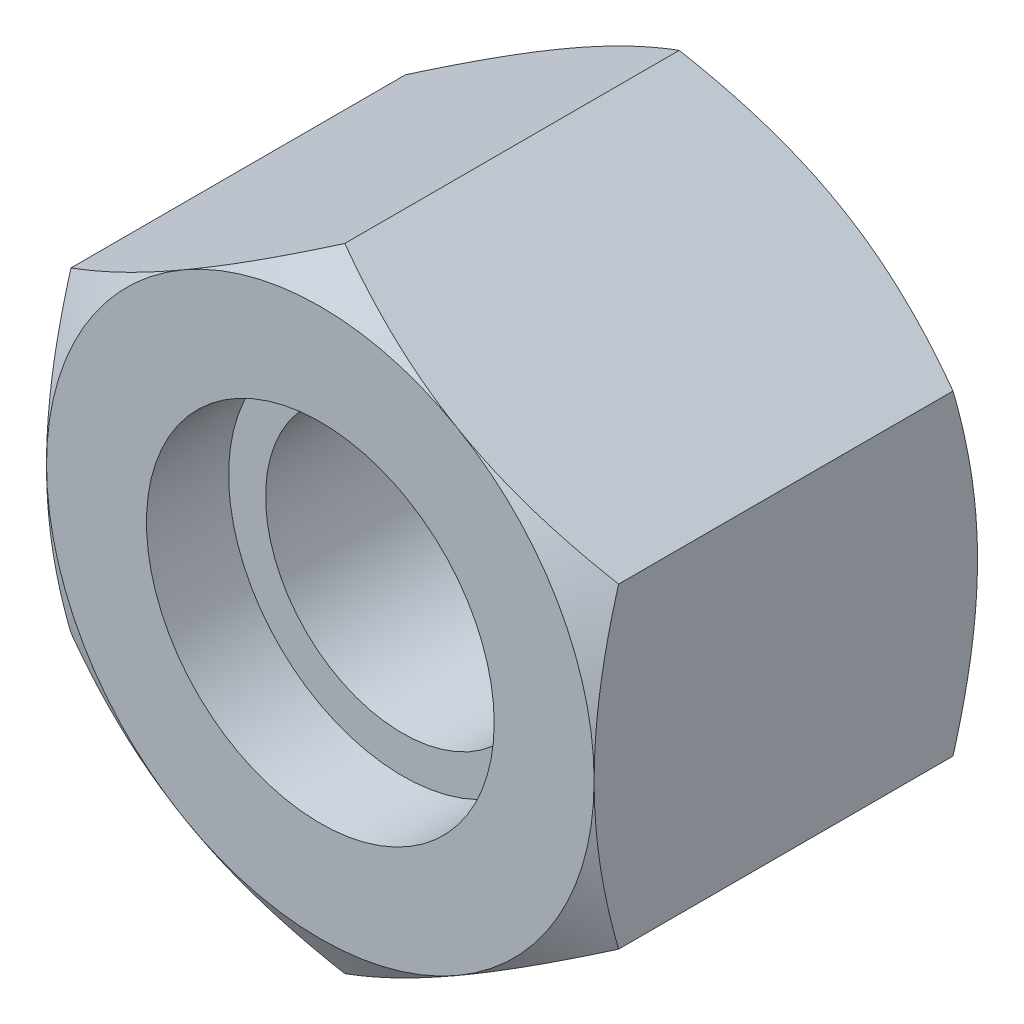
ISO-10303-21;
HEADER;
FILE_DESCRIPTION(('STEP AP214'),'2;1');
FILE_NAME('part.step','',(''),(''),'','','');
FILE_SCHEMA(('AUTOMOTIVE_DESIGN { 1 0 10303 214 1 1 1 1 }'));
ENDSEC;
DATA;
#1=APPLICATION_CONTEXT('core data for automotive mechanical design processes');
#2=APPLICATION_PROTOCOL_DEFINITION('international standard','automotive_design',2000,#1);
#3=PRODUCT_CONTEXT('',#1,'mechanical');
#4=PRODUCT('Part','Part','',(#3));
#5=PRODUCT_RELATED_PRODUCT_CATEGORY('part','',(#4));
#6=PRODUCT_DEFINITION_FORMATION('','',#4);
#7=PRODUCT_DEFINITION_CONTEXT('part definition',#1,'design');
#8=PRODUCT_DEFINITION('design','',#6,#7);
#9=PRODUCT_DEFINITION_SHAPE('','',#8);
#10=(LENGTH_UNIT() NAMED_UNIT(*) SI_UNIT(.MILLI.,.METRE.));
#11=(NAMED_UNIT(*) PLANE_ANGLE_UNIT() SI_UNIT($,.RADIAN.));
#12=(NAMED_UNIT(*) SI_UNIT($,.STERADIAN.) SOLID_ANGLE_UNIT());
#13=UNCERTAINTY_MEASURE_WITH_UNIT(LENGTH_MEASURE(1.E-05),#10,'distance_accuracy_value','');
#14=(GEOMETRIC_REPRESENTATION_CONTEXT(3) GLOBAL_UNCERTAINTY_ASSIGNED_CONTEXT((#13)) GLOBAL_UNIT_ASSIGNED_CONTEXT((#10,
#11,#12)) REPRESENTATION_CONTEXT('',''));
#15=CARTESIAN_POINT('',(0.,0.,0.));
#16=DIRECTION('',(0.,0.,1.));
#17=DIRECTION('',(1.,0.,0.));
#18=AXIS2_PLACEMENT_3D('',#15,#16,#17);
#19=CARTESIAN_POINT('',(0.,0.,7.));
#20=DIRECTION('',(0.,0.,1.));
#21=DIRECTION('',(1.,0.,0.));
#22=AXIS2_PLACEMENT_3D('',#19,#20,#21);
#23=CYLINDRICAL_SURFACE('',#22,2.5);
#24=CARTESIAN_POINT('',(0.,0.,0.));
#25=DIRECTION('',(0.,0.,1.));
#26=DIRECTION('',(1.,0.,0.));
#27=AXIS2_PLACEMENT_3D('',#24,#25,#26);
#28=CIRCLE('',#27,2.5);
#29=CARTESIAN_POINT('',(2.5,0.,0.));
#30=VERTEX_POINT('',#29);
#31=EDGE_CURVE('E231',#30,#30,#28,.T.);
#32=ORIENTED_EDGE('',*,*,#31,.F.);
#33=EDGE_LOOP('',(#32));
#34=FACE_BOUND('',#33,.T.);
#35=CARTESIAN_POINT('',(0.,0.,5.5));
#36=DIRECTION('',(0.,0.,1.));
#37=DIRECTION('',(1.,0.,0.));
#38=AXIS2_PLACEMENT_3D('',#35,#36,#37);
#39=CIRCLE('',#38,2.5);
#40=CARTESIAN_POINT('',(2.5,0.,5.5));
#41=VERTEX_POINT('',#40);
#42=EDGE_CURVE('E37',#41,#41,#39,.F.);
#43=ORIENTED_EDGE('',*,*,#42,.F.);
#44=EDGE_LOOP('',(#43));
#45=FACE_BOUND('',#44,.T.);
#46=ADVANCED_FACE('F32',(#34,#45),#23,.F.);
#47=CARTESIAN_POINT('',(5.,2.88675134594813,7.));
#48=DIRECTION('',(-0.5,-0.866025403784439,0.));
#49=DIRECTION('',(0.866025403784439,-0.5,0.));
#50=AXIS2_PLACEMENT_3D('',#47,#48,#49);
#51=PLANE('',#50);
#52=DIRECTION('',(0.,0.,-1.));
#53=VECTOR('',#52,1.);
#54=CARTESIAN_POINT('',(5.,2.88675134594813,7.));
#55=LINE('',#54,#53);
#56=CARTESIAN_POINT('',(5.,2.88675134594813,6.5534180126148));
#57=VERTEX_POINT('',#56);
#58=CARTESIAN_POINT('',(5.,2.88675134594813,0.446581987385197));
#59=VERTEX_POINT('',#58);
#60=EDGE_CURVE('E148',#57,#59,#55,.T.);
#61=ORIENTED_EDGE('',*,*,#60,.T.);
#62=CARTESIAN_POINT('',(5.0002,2.88663587589429,0.446648656051824));
#63=CARTESIAN_POINT('',(4.78046540547481,3.01349970319368,0.373386567637631));
#64=CARTESIAN_POINT('',(4.55885141554042,3.14144859993849,0.306751321918089));
#65=CARTESIAN_POINT('',(4.11178600454649,3.39956193532121,0.190438991010809));
#66=CARTESIAN_POINT('',(3.88632664040923,3.52973095989718,0.140803049915787));
#67=CARTESIAN_POINT('',(3.43816769477649,3.78847564779797,0.0635510254186972));
#68=CARTESIAN_POINT('',(3.21553790689581,3.91701101576052,0.0354203782834892));
#69=CARTESIAN_POINT('',(2.88081009815336,4.11026620624322,0.0101949219536843));
#70=CARTESIAN_POINT('',(2.76915780319494,4.17472868879311,0.00461345976948369));
#71=CARTESIAN_POINT('',(2.5457500293262,4.30371322717528,-0.000797783248529976));
#72=CARTESIAN_POINT('',(2.43399455370969,4.36823528110589,-0.000627741741796593));
#73=CARTESIAN_POINT('',(2.12781576914936,4.54500768479194,0.00775363179203671));
#74=CARTESIAN_POINT('',(1.93349391403279,4.65719946015292,0.0218297718972513));
#75=CARTESIAN_POINT('',(1.54613989800229,4.88083840557981,0.06646525710943));
#76=CARTESIAN_POINT('',(1.35310909862843,4.9922847895602,0.0970398601475072));
#77=CARTESIAN_POINT('',(0.964974657525146,5.21637431361295,0.173468493621162));
#78=CARTESIAN_POINT('',(0.769920001358264,5.32898917185759,0.219646378878678));
#79=CARTESIAN_POINT('',(0.382719654641231,5.55253939626498,0.324451794491931));
#80=CARTESIAN_POINT('',(0.190569004591912,5.66347762579592,0.383054703437371));
#81=CARTESIAN_POINT('',(-0.000200000000001403,5.77361816195009,0.446648656051825));
#82=B_SPLINE_CURVE_WITH_KNOTS('',3,(#62,#63,#64,#65,#66,#67,#68,#69,#70,#71,#72,#73,#74,#75,#76,
#77,#78,#79,#80,#81),.UNSPECIFIED.,.F.,.F.,(4,2,2,2,2,2,2,2,2,4),(0.,0.792555841363088,
1.58701660053333,2.3618153748728,2.74884076077325,3.13585419177295,3.80962362599679,
4.48401723901189,5.17336882348928,5.86136694793725),.UNSPECIFIED.);
#83=CARTESIAN_POINT('',(2.5,4.33012701892219,0.));
#84=VERTEX_POINT('',#83);
#85=EDGE_CURVE('E55',#59,#84,#82,.T.);
#86=ORIENTED_EDGE('',*,*,#85,.T.);
#87=CARTESIAN_POINT('',(0.,5.77350269189626,0.446581987385198));
#88=VERTEX_POINT('',#87);
#89=EDGE_CURVE('E123',#84,#88,#82,.T.);
#90=ORIENTED_EDGE('',*,*,#89,.T.);
#91=DIRECTION('',(0.,0.,-1.));
#92=VECTOR('',#91,1.);
#93=CARTESIAN_POINT('',(0.,5.77350269189626,7.));
#94=LINE('',#93,#92);
#95=CARTESIAN_POINT('',(0.,5.77350269189626,6.5534180126148));
#96=VERTEX_POINT('',#95);
#97=EDGE_CURVE('E243',#96,#88,#94,.T.);
#98=ORIENTED_EDGE('',*,*,#97,.F.);
#99=CARTESIAN_POINT('',(-0.000200000000001735,5.77361816195009,6.55335134394817));
#100=CARTESIAN_POINT('',(0.219534594525183,5.6467543346507,6.62661343236237));
#101=CARTESIAN_POINT('',(0.441148584459579,5.5188054379059,6.69324867808191));
#102=CARTESIAN_POINT('',(0.888213995453512,5.26069210252318,6.80956100898919));
#103=CARTESIAN_POINT('',(1.11367335959077,5.13052307794721,6.85919695008421));
#104=CARTESIAN_POINT('',(1.56183230522351,4.87177839004641,6.9364489745813));
#105=CARTESIAN_POINT('',(1.78446209310419,4.74324302208387,6.96457962171651));
#106=CARTESIAN_POINT('',(2.11918990184664,4.54998783160116,6.98980507804632));
#107=CARTESIAN_POINT('',(2.23084219680506,4.48552534905128,6.99538654023052));
#108=CARTESIAN_POINT('',(2.45424997067379,4.35654081066911,7.00079778324853));
#109=CARTESIAN_POINT('',(2.56600544629031,4.2920187567385,7.0006277417418));
#110=CARTESIAN_POINT('',(2.87218423085064,4.11524635305244,6.99224636820796));
#111=CARTESIAN_POINT('',(3.06650608596721,4.00305457769146,6.97817022810275));
#112=CARTESIAN_POINT('',(3.4538601019977,3.77941563226457,6.93353474289057));
#113=CARTESIAN_POINT('',(3.64689090137157,3.66796924828419,6.90296013985249));
#114=CARTESIAN_POINT('',(4.03502534247485,3.44387972423144,6.82653150637884));
#115=CARTESIAN_POINT('',(4.23007999864173,3.3312648659868,6.78035362112132));
#116=CARTESIAN_POINT('',(4.61728034535877,3.1077146415794,6.67554820550807));
#117=CARTESIAN_POINT('',(4.80943099540808,2.99677641204847,6.61694529656263));
#118=CARTESIAN_POINT('',(5.0002,2.88663587589429,6.55335134394817));
#119=B_SPLINE_CURVE_WITH_KNOTS('',3,(#99,#100,#101,#102,#103,#104,#105,#106,#107,#108,#109,#110,
#111,#112,#113,#114,#115,#116,#117,#118),.UNSPECIFIED.,.F.,.F.,(4,2,2,2,2,2,2,2,2,4),(0.,
0.79255584136309,1.58701660053333,2.3618153748728,2.74884076077325,3.13585419177295,
3.80962362599679,4.48401723901189,5.17336882348928,5.86136694793725),.UNSPECIFIED.);
#120=CARTESIAN_POINT('',(2.5,4.33012701892219,7.));
#121=VERTEX_POINT('',#120);
#122=EDGE_CURVE('E288',#96,#121,#119,.T.);
#123=ORIENTED_EDGE('',*,*,#122,.T.);
#124=EDGE_CURVE('E294',#121,#57,#119,.T.);
#125=ORIENTED_EDGE('',*,*,#124,.T.);
#126=EDGE_LOOP('',(#61,#86,#90,#98,#123,#125));
#127=FACE_BOUND('',#126,.T.);
#128=ADVANCED_FACE('F34',(#127),#51,.F.);
#129=CARTESIAN_POINT('',(0.,5.77350269189626,7.));
#130=DIRECTION('',(0.5,-0.866025403784439,0.));
#131=DIRECTION('',(0.866025403784439,0.5,0.));
#132=AXIS2_PLACEMENT_3D('',#129,#130,#131);
#133=PLANE('',#132);
#134=ORIENTED_EDGE('',*,*,#97,.T.);
#135=CARTESIAN_POINT('',(0.000199999999998311,5.7736181619501,0.446648656051825));
#136=CARTESIAN_POINT('',(-0.219534594525186,5.64675433465071,0.373386567637632));
#137=CARTESIAN_POINT('',(-0.441148584459582,5.5188054379059,0.30675132191809));
#138=CARTESIAN_POINT('',(-0.888213995453514,5.26069210252318,0.19043899101081));
#139=CARTESIAN_POINT('',(-1.11367335959077,5.13052307794721,0.140803049915788));
#140=CARTESIAN_POINT('',(-1.56183230522351,4.87177839004641,0.0635510254186978));
#141=CARTESIAN_POINT('',(-1.78446209310419,4.74324302208387,0.0354203782834896));
#142=CARTESIAN_POINT('',(-2.11918990184664,4.54998783160116,0.010194921953685));
#143=CARTESIAN_POINT('',(-2.23084219680506,4.48552534905128,0.00461345976948456));
#144=CARTESIAN_POINT('',(-2.4542499706738,4.35654081066911,-0.00079778324852902));
#145=CARTESIAN_POINT('',(-2.56600544629031,4.2920187567385,-0.000627741741795739));
#146=CARTESIAN_POINT('',(-2.87218423085064,4.11524635305244,0.00775363179203752));
#147=CARTESIAN_POINT('',(-3.06650608596721,4.00305457769146,0.0218297718972523));
#148=CARTESIAN_POINT('',(-3.4538601019977,3.77941563226458,0.0664652571094308));
#149=CARTESIAN_POINT('',(-3.64689090137157,3.66796924828419,0.0970398601475075));
#150=CARTESIAN_POINT('',(-4.03502534247485,3.44387972423144,0.173468493621162));
#151=CARTESIAN_POINT('',(-4.23007999864173,3.3312648659868,0.219646378878678));
#152=CARTESIAN_POINT('',(-4.61728034535877,3.10771464157941,0.324451794491931));
#153=CARTESIAN_POINT('',(-4.80943099540808,2.99677641204847,0.383054703437371));
#154=CARTESIAN_POINT('',(-5.0002,2.88663587589429,0.446648656051824));
#155=B_SPLINE_CURVE_WITH_KNOTS('',3,(#135,#136,#137,#138,#139,#140,#141,#142,#143,#144,#145,
#146,#147,#148,#149,#150,#151,#152,#153,#154),.UNSPECIFIED.,.F.,.F.,(4,2,2,2,2,2,2,2,2,4),(0.,
0.792555841363089,1.58701660053333,2.3618153748728,2.74884076077325,3.13585419177295,
3.80962362599679,4.48401723901189,5.17336882348928,5.86136694793724),.UNSPECIFIED.);
#156=CARTESIAN_POINT('',(-2.5,4.33012701892219,0.));
#157=VERTEX_POINT('',#156);
#158=EDGE_CURVE('E128',#88,#157,#155,.T.);
#159=ORIENTED_EDGE('',*,*,#158,.T.);
#160=CARTESIAN_POINT('',(-5.,2.88675134594813,0.446581987385198));
#161=VERTEX_POINT('',#160);
#162=EDGE_CURVE('E158',#157,#161,#155,.T.);
#163=ORIENTED_EDGE('',*,*,#162,.T.);
#164=DIRECTION('',(0.,0.,-1.));
#165=VECTOR('',#164,1.);
#166=CARTESIAN_POINT('',(-5.,2.88675134594813,7.));
#167=LINE('',#166,#165);
#168=CARTESIAN_POINT('',(-5.,2.88675134594813,6.5534180126148));
#169=VERTEX_POINT('',#168);
#170=EDGE_CURVE('E240',#169,#161,#167,.T.);
#171=ORIENTED_EDGE('',*,*,#170,.F.);
#172=CARTESIAN_POINT('',(-5.0002,2.88663587589429,6.55335134394817));
#173=CARTESIAN_POINT('',(-4.78046540547481,3.01349970319368,6.62661343236237));
#174=CARTESIAN_POINT('',(-4.55885141554042,3.14144859993849,6.69324867808191));
#175=CARTESIAN_POINT('',(-4.11178600454648,3.39956193532121,6.80956100898919));
#176=CARTESIAN_POINT('',(-3.88632664040922,3.52973095989718,6.85919695008421));
#177=CARTESIAN_POINT('',(-3.43816769477649,3.78847564779798,6.9364489745813));
#178=CARTESIAN_POINT('',(-3.21553790689581,3.91701101576052,6.96457962171651));
#179=CARTESIAN_POINT('',(-2.88081009815336,4.11026620624322,6.98980507804631));
#180=CARTESIAN_POINT('',(-2.76915780319494,4.17472868879311,6.99538654023052));
#181=CARTESIAN_POINT('',(-2.5457500293262,4.30371322717528,7.00079778324853));
#182=CARTESIAN_POINT('',(-2.43399455370969,4.36823528110589,7.0006277417418));
#183=CARTESIAN_POINT('',(-2.12781576914936,4.54500768479194,6.99224636820796));
#184=CARTESIAN_POINT('',(-1.93349391403279,4.65719946015293,6.97817022810275));
#185=CARTESIAN_POINT('',(-1.54613989800229,4.88083840557981,6.93353474289057));
#186=CARTESIAN_POINT('',(-1.35310909862843,4.9922847895602,6.90296013985249));
#187=CARTESIAN_POINT('',(-0.964974657525146,5.21637431361295,6.82653150637884));
#188=CARTESIAN_POINT('',(-0.769920001358265,5.32898917185759,6.78035362112132));
#189=CARTESIAN_POINT('',(-0.382719654641233,5.55253939626498,6.67554820550807));
#190=CARTESIAN_POINT('',(-0.190569004591915,5.66347762579592,6.61694529656263));
#191=CARTESIAN_POINT('',(0.000199999999998361,5.7736181619501,6.55335134394817));
#192=B_SPLINE_CURVE_WITH_KNOTS('',3,(#172,#173,#174,#175,#176,#177,#178,#179,#180,#181,#182,
#183,#184,#185,#186,#187,#188,#189,#190,#191),.UNSPECIFIED.,.F.,.F.,(4,2,2,2,2,2,2,2,2,4),(0.,
0.792555841363089,1.58701660053333,2.3618153748728,2.74884076077325,3.13585419177295,
3.80962362599679,4.48401723901189,5.17336882348928,5.86136694793725),.UNSPECIFIED.);
#193=CARTESIAN_POINT('',(-2.5,4.33012701892219,7.));
#194=VERTEX_POINT('',#193);
#195=EDGE_CURVE('E280',#169,#194,#192,.T.);
#196=ORIENTED_EDGE('',*,*,#195,.T.);
#197=EDGE_CURVE('E224',#194,#96,#192,.T.);
#198=ORIENTED_EDGE('',*,*,#197,.T.);
#199=EDGE_LOOP('',(#134,#159,#163,#171,#196,#198));
#200=FACE_BOUND('',#199,.T.);
#201=ADVANCED_FACE('F209',(#200),#133,.F.);
#202=CARTESIAN_POINT('',(-5.,2.88675134594813,7.));
#203=DIRECTION('',(1.,0.,0.));
#204=DIRECTION('',(0.,0.,-1.));
#205=AXIS2_PLACEMENT_3D('',#202,#203,#204);
#206=PLANE('',#205);
#207=ORIENTED_EDGE('',*,*,#170,.T.);
#208=CARTESIAN_POINT('',(-5.,-7.65608998744864,2.39263352655076));
#209=CARTESIAN_POINT('',(-5.,-7.43656171400165,2.28654533817203));
#210=CARTESIAN_POINT('',(-5.,-7.21651440170021,2.18151175461592));
#211=CARTESIAN_POINT('',(-5.,-6.77510105921518,1.97415643363973));
#212=CARTESIAN_POINT('',(-5.,-6.55373480873052,1.87183516574565));
#213=CARTESIAN_POINT('',(-5.,-6.10820714710356,1.66996807853488));
#214=CARTESIAN_POINT('',(-5.,-5.88403698971124,1.57044149281728));
#215=CARTESIAN_POINT('',(-5.,-5.43385418074677,1.37566323278679));
#216=CARTESIAN_POINT('',(-5.,-5.20784162594278,1.28041133564241));
#217=CARTESIAN_POINT('',(-5.,-4.75080884782755,1.09418830918939));
#218=CARTESIAN_POINT('',(-5.,-4.51976121099505,1.00328409099868));
#219=CARTESIAN_POINT('',(-5.,-4.05494053422099,0.828595302971934));
#220=CARTESIAN_POINT('',(-5.,-3.82116719434024,0.744811525247638));
#221=CARTESIAN_POINT('',(-5.,-3.35100416711889,0.586614632364607));
#222=CARTESIAN_POINT('',(-5.,-3.11462125088187,0.512181595225261));
#223=CARTESIAN_POINT('',(-5.,-2.63849247870023,0.37510439387237));
#224=CARTESIAN_POINT('',(-5.,-2.3987477121033,0.312456501596943));
#225=CARTESIAN_POINT('',(-5.,-1.91574303714497,0.201987753994864));
#226=CARTESIAN_POINT('',(-5.,-1.672482210841,0.154170846558638));
#227=CARTESIAN_POINT('',(-5.,-1.18299359688664,0.0765955557923999));
#228=CARTESIAN_POINT('',(-5.,-0.936765806613281,0.0468371884284072));
#229=CARTESIAN_POINT('',(-5.,-0.567032279323848,0.0176512015862948));
#230=CARTESIAN_POINT('',(-5.,-0.444105297658541,0.0104963190599454));
#231=CARTESIAN_POINT('',(-5.,-0.198053005238567,0.00139545226903951));
#232=CARTESIAN_POINT('',(-5.,-0.0749276970802309,-0.0005505996396156));
#233=CARTESIAN_POINT('',(-5.,0.17125799989235,0.000818470345662896));
#234=CARTESIAN_POINT('',(-5.,0.294318397227085,0.00413211431301021));
#235=CARTESIAN_POINT('',(-5.,0.540192730788837,0.0159365972827583));
#236=CARTESIAN_POINT('',(-5.,0.66300665426348,0.0244276975701632));
#237=CARTESIAN_POINT('',(-5.,0.960681872881667,0.051106380275299));
#238=CARTESIAN_POINT('',(-5.,1.1353143627994,0.0718889676982845));
#239=CARTESIAN_POINT('',(-5.,1.4832167579939,0.122765655722693));
#240=CARTESIAN_POINT('',(-5.,1.65648647841238,0.152860997990033));
#241=CARTESIAN_POINT('',(-5.,2.00155426058701,0.221298792011551));
#242=CARTESIAN_POINT('',(-5.,2.17335067370375,0.259649477486405));
#243=CARTESIAN_POINT('',(-5.,2.51518168221057,0.343428305385013));
#244=CARTESIAN_POINT('',(-5.,2.68521638419314,0.388856016914003));
#245=CARTESIAN_POINT('',(-5.,3.02770318928896,0.486887782054295));
#246=CARTESIAN_POINT('',(-5.,3.20011248435316,0.539640363823946));
#247=CARTESIAN_POINT('',(-5.,3.54310870430182,0.650357787302631));
#248=CARTESIAN_POINT('',(-5.,3.7136967965972,0.708319033907076));
#249=CARTESIAN_POINT('',(-5.,4.0523661026798,0.828256540728482));
#250=CARTESIAN_POINT('',(-5.,4.22045602230062,0.890208365426373));
#251=CARTESIAN_POINT('',(-5.,4.55533171687455,1.01774823413813));
#252=CARTESIAN_POINT('',(-5.,4.72211693321422,1.08333774778778));
#253=CARTESIAN_POINT('',(-5.,4.88829623733363,1.15038625817726));
#254=B_SPLINE_CURVE_WITH_KNOTS('',3,(#208,#209,#210,#211,#212,#213,#214,#215,#216,#217,#218,
#219,#220,#221,#222,#223,#224,#225,#226,#227,#228,#229,#230,#231,#232,#233,#234,#235,#236,#237,
#238,#239,#240,#241,#242,#243,#244,#245,#246,#247,#248,#249,#250,#251,#252,#253),.UNSPECIFIED.,
.F.,.F.,(4,2,2,2,2,2,2,2,2,2,2,2,2,2,2,2,2,2,2,2,2,2,4),(0.,0.731464740665348,1.46305528824908,
2.19883243307485,2.93457117856032,3.67934251246856,4.4241965901336,5.16743580871988,
5.91043951739337,6.65364083834804,7.39684281638514,7.76615414335454,8.13546067426608,
8.50466345177853,8.8738848629845,9.40118542949726,9.92855633110014,10.4564556797854,
10.9843228991235,11.525120280828,12.065547221064,12.6029322754131,13.1405360390026),.UNSPECIFIED.);
#255=CARTESIAN_POINT('',(-5.,0.,0.));
#256=VERTEX_POINT('',#255);
#257=EDGE_CURVE('E203',#161,#256,#254,.F.);
#258=ORIENTED_EDGE('',*,*,#257,.T.);
#259=CARTESIAN_POINT('',(-5.,-2.88675134594813,0.446581987385197));
#260=VERTEX_POINT('',#259);
#261=EDGE_CURVE('E197',#256,#260,#254,.F.);
#262=ORIENTED_EDGE('',*,*,#261,.T.);
#263=DIRECTION('',(0.,0.,-1.));
#264=VECTOR('',#263,1.);
#265=CARTESIAN_POINT('',(-5.,-2.88675134594813,7.));
#266=LINE('',#265,#264);
#267=CARTESIAN_POINT('',(-5.,-2.88675134594813,6.5534180126148));
#268=VERTEX_POINT('',#267);
#269=EDGE_CURVE('E237',#268,#260,#266,.T.);
#270=ORIENTED_EDGE('',*,*,#269,.F.);
#271=CARTESIAN_POINT('',(-5.,-7.65608998744864,4.60736647344924));
#272=CARTESIAN_POINT('',(-5.,-7.43656171400165,4.71345466182797));
#273=CARTESIAN_POINT('',(-5.,-7.21651440170021,4.81848824538408));
#274=CARTESIAN_POINT('',(-5.,-6.77510105921518,5.02584356636027));
#275=CARTESIAN_POINT('',(-5.,-6.55373480873052,5.12816483425435));
#276=CARTESIAN_POINT('',(-5.,-6.10820714710356,5.33003192146512));
#277=CARTESIAN_POINT('',(-5.,-5.88403698971124,5.42955850718272));
#278=CARTESIAN_POINT('',(-5.,-5.43385418074676,5.62433676721321));
#279=CARTESIAN_POINT('',(-5.,-5.20784162594277,5.71958866435759));
#280=CARTESIAN_POINT('',(-5.,-4.75080884782755,5.90581169081061));
#281=CARTESIAN_POINT('',(-5.,-4.51976121099505,5.99671590900132));
#282=CARTESIAN_POINT('',(-5.,-4.05494053422099,6.17140469702806));
#283=CARTESIAN_POINT('',(-5.,-3.82116719434024,6.25518847475236));
#284=CARTESIAN_POINT('',(-5.,-3.35100416711888,6.41338536763539));
#285=CARTESIAN_POINT('',(-5.,-3.11462125088187,6.48781840477474));
#286=CARTESIAN_POINT('',(-5.,-2.63849247870023,6.62489560612763));
#287=CARTESIAN_POINT('',(-5.,-2.3987477121033,6.68754349840306));
#288=CARTESIAN_POINT('',(-5.,-1.91574303714497,6.79801224600514));
#289=CARTESIAN_POINT('',(-5.,-1.67248221084099,6.84582915344136));
#290=CARTESIAN_POINT('',(-5.,-1.18299359688664,6.9234044442076));
#291=CARTESIAN_POINT('',(-5.,-0.93676580661328,6.95316281157159));
#292=CARTESIAN_POINT('',(-5.,-0.567032279323848,6.9823487984137));
#293=CARTESIAN_POINT('',(-5.,-0.44410529765854,6.98950368094005));
#294=CARTESIAN_POINT('',(-5.,-0.198053005238566,6.99860454773096));
#295=CARTESIAN_POINT('',(-5.,-0.0749276970802304,7.00055059963961));
#296=CARTESIAN_POINT('',(-5.,0.171257999892351,6.99918152965434));
#297=CARTESIAN_POINT('',(-5.,0.294318397227085,6.99586788568699));
#298=CARTESIAN_POINT('',(-5.,0.540192730788837,6.98406340271724));
#299=CARTESIAN_POINT('',(-5.,0.66300665426348,6.97557230242984));
#300=CARTESIAN_POINT('',(-5.,0.960681872881666,6.9488936197247));
#301=CARTESIAN_POINT('',(-5.,1.1353143627994,6.92811103230171));
#302=CARTESIAN_POINT('',(-5.,1.4832167579939,6.87723434427731));
#303=CARTESIAN_POINT('',(-5.,1.65648647841237,6.84713900200997));
#304=CARTESIAN_POINT('',(-5.,2.00155426058701,6.77870120798845));
#305=CARTESIAN_POINT('',(-5.,2.17335067370375,6.74035052251359));
#306=CARTESIAN_POINT('',(-5.,2.51518168221057,6.65657169461499));
#307=CARTESIAN_POINT('',(-5.,2.68521638419314,6.611143983086));
#308=CARTESIAN_POINT('',(-5.,3.02770318928896,6.5131122179457));
#309=CARTESIAN_POINT('',(-5.,3.20011248435316,6.46035963617605));
#310=CARTESIAN_POINT('',(-5.,3.54310870430182,6.34964221269737));
#311=CARTESIAN_POINT('',(-5.,3.71369679659719,6.29168096609292));
#312=CARTESIAN_POINT('',(-5.,4.05236610267979,6.17174345927152));
#313=CARTESIAN_POINT('',(-5.,4.22045602230062,6.10979163457363));
#314=CARTESIAN_POINT('',(-5.,4.55533171687455,5.98225176586187));
#315=CARTESIAN_POINT('',(-5.,4.72211693321421,5.91666225221222));
#316=CARTESIAN_POINT('',(-5.,4.88829623733363,5.84961374182275));
#317=B_SPLINE_CURVE_WITH_KNOTS('',3,(#271,#272,#273,#274,#275,#276,#277,#278,#279,#280,#281,
#282,#283,#284,#285,#286,#287,#288,#289,#290,#291,#292,#293,#294,#295,#296,#297,#298,#299,#300,
#301,#302,#303,#304,#305,#306,#307,#308,#309,#310,#311,#312,#313,#314,#315,#316),.UNSPECIFIED.,
.F.,.F.,(4,2,2,2,2,2,2,2,2,2,2,2,2,2,2,2,2,2,2,2,2,2,4),(0.,0.73146474066535,1.46305528824908,
2.19883243307486,2.93457117856033,3.67934251246857,4.4241965901336,5.16743580871988,
5.91043951739337,6.65364083834804,7.39684281638514,7.76615414335454,8.13546067426608,
8.50466345177853,8.8738848629845,9.40118542949726,9.92855633110014,10.4564556797854,
10.9843228991235,11.525120280828,12.065547221064,12.6029322754131,13.1405360390026),.UNSPECIFIED.);
#318=CARTESIAN_POINT('',(-5.,0.,7.));
#319=VERTEX_POINT('',#318);
#320=EDGE_CURVE('E222',#268,#319,#317,.T.);
#321=ORIENTED_EDGE('',*,*,#320,.T.);
#322=EDGE_CURVE('E215',#319,#169,#317,.T.);
#323=ORIENTED_EDGE('',*,*,#322,.T.);
#324=EDGE_LOOP('',(#207,#258,#262,#270,#321,#323));
#325=FACE_BOUND('',#324,.T.);
#326=ADVANCED_FACE('F205',(#325),#206,.F.);
#327=CARTESIAN_POINT('',(-5.,-2.88675134594813,7.));
#328=DIRECTION('',(0.5,0.866025403784439,0.));
#329=DIRECTION('',(-0.866025403784439,0.5,0.));
#330=AXIS2_PLACEMENT_3D('',#327,#328,#329);
#331=PLANE('',#330);
#332=ORIENTED_EDGE('',*,*,#269,.T.);
#333=CARTESIAN_POINT('',(-5.0002,-2.88663587589429,0.446648656051823));
#334=CARTESIAN_POINT('',(-4.78046540547481,-3.01349970319368,0.37338656763763));
#335=CARTESIAN_POINT('',(-4.55885141554042,-3.14144859993849,0.306751321918088));
#336=CARTESIAN_POINT('',(-4.11178600454648,-3.39956193532121,0.190438991010808));
#337=CARTESIAN_POINT('',(-3.88632664040922,-3.52973095989718,0.140803049915787));
#338=CARTESIAN_POINT('',(-3.43816769477649,-3.78847564779798,0.063551025418696));
#339=CARTESIAN_POINT('',(-3.21553790689581,-3.91701101576052,0.035420378283487));
#340=CARTESIAN_POINT('',(-2.88081009815336,-4.11026620624322,0.0101949219536827));
#341=CARTESIAN_POINT('',(-2.76915780319494,-4.17472868879311,0.00461345976948261));
#342=CARTESIAN_POINT('',(-2.5457500293262,-4.30371322717528,-0.000797783248530982));
#343=CARTESIAN_POINT('',(-2.43399455370968,-4.36823528110589,-0.000627741741798111));
#344=CARTESIAN_POINT('',(-2.12781576914936,-4.54500768479194,0.00775363179203465));
#345=CARTESIAN_POINT('',(-1.93349391403279,-4.65719946015292,0.0218297718972499));
#346=CARTESIAN_POINT('',(-1.54613989800229,-4.88083840557981,0.066465257109429));
#347=CARTESIAN_POINT('',(-1.35310909862843,-4.9922847895602,0.0970398601475058));
#348=CARTESIAN_POINT('',(-0.964974657525144,-5.21637431361295,0.17346849362116));
#349=CARTESIAN_POINT('',(-0.769920001358262,-5.32898917185759,0.219646378878676));
#350=CARTESIAN_POINT('',(-0.382719654641229,-5.55253939626498,0.324451794491929));
#351=CARTESIAN_POINT('',(-0.190569004591911,-5.66347762579592,0.383054703437369));
#352=CARTESIAN_POINT('',(0.00020000000000232,-5.77361816195009,0.446648656051823));
#353=B_SPLINE_CURVE_WITH_KNOTS('',3,(#333,#334,#335,#336,#337,#338,#339,#340,#341,#342,#343,
#344,#345,#346,#347,#348,#349,#350,#351,#352),.UNSPECIFIED.,.F.,.F.,(4,2,2,2,2,2,2,2,2,4),(0.,
0.792555841363089,1.58701660053333,2.3618153748728,2.74884076077325,3.13585419177295,
3.80962362599679,4.48401723901189,5.17336882348928,5.86136694793725),.UNSPECIFIED.);
#354=CARTESIAN_POINT('',(-2.5,-4.33012701892219,0.));
#355=VERTEX_POINT('',#354);
#356=EDGE_CURVE('E204',#260,#355,#353,.T.);
#357=ORIENTED_EDGE('',*,*,#356,.T.);
#358=CARTESIAN_POINT('',(0.,-5.77350269189626,0.446581987385197));
#359=VERTEX_POINT('',#358);
#360=EDGE_CURVE('E192',#355,#359,#353,.T.);
#361=ORIENTED_EDGE('',*,*,#360,.T.);
#362=DIRECTION('',(0.,0.,-1.));
#363=VECTOR('',#362,1.);
#364=CARTESIAN_POINT('',(0.,-5.77350269189626,7.));
#365=LINE('',#364,#363);
#366=CARTESIAN_POINT('',(0.,-5.77350269189626,6.5534180126148));
#367=VERTEX_POINT('',#366);
#368=EDGE_CURVE('E234',#367,#359,#365,.T.);
#369=ORIENTED_EDGE('',*,*,#368,.F.);
#370=CARTESIAN_POINT('',(0.00020000000000206,-5.77361816195009,6.55335134394817));
#371=CARTESIAN_POINT('',(-0.219534594525183,-5.6467543346507,6.62661343236237));
#372=CARTESIAN_POINT('',(-0.441148584459578,-5.5188054379059,6.69324867808191));
#373=CARTESIAN_POINT('',(-0.88821399545351,-5.26069210252318,6.80956100898919));
#374=CARTESIAN_POINT('',(-1.11367335959077,-5.13052307794721,6.85919695008421));
#375=CARTESIAN_POINT('',(-1.56183230522351,-4.87177839004641,6.9364489745813));
#376=CARTESIAN_POINT('',(-1.78446209310419,-4.74324302208387,6.96457962171651));
#377=CARTESIAN_POINT('',(-2.11918990184664,-4.54998783160116,6.98980507804632));
#378=CARTESIAN_POINT('',(-2.23084219680506,-4.48552534905128,6.99538654023052));
#379=CARTESIAN_POINT('',(-2.45424997067379,-4.35654081066911,7.00079778324853));
#380=CARTESIAN_POINT('',(-2.56600544629031,-4.2920187567385,7.0006277417418));
#381=CARTESIAN_POINT('',(-2.87218423085063,-4.11524635305244,6.99224636820796));
#382=CARTESIAN_POINT('',(-3.06650608596721,-4.00305457769146,6.97817022810275));
#383=CARTESIAN_POINT('',(-3.4538601019977,-3.77941563226457,6.93353474289057));
#384=CARTESIAN_POINT('',(-3.64689090137157,-3.66796924828419,6.90296013985249));
#385=CARTESIAN_POINT('',(-4.03502534247485,-3.44387972423144,6.82653150637884));
#386=CARTESIAN_POINT('',(-4.23007999864173,-3.3312648659868,6.78035362112132));
#387=CARTESIAN_POINT('',(-4.61728034535876,-3.10771464157941,6.67554820550807));
#388=CARTESIAN_POINT('',(-4.80943099540808,-2.99677641204847,6.61694529656263));
#389=CARTESIAN_POINT('',(-5.0002,-2.88663587589429,6.55335134394817));
#390=B_SPLINE_CURVE_WITH_KNOTS('',3,(#370,#371,#372,#373,#374,#375,#376,#377,#378,#379,#380,
#381,#382,#383,#384,#385,#386,#387,#388,#389),.UNSPECIFIED.,.F.,.F.,(4,2,2,2,2,2,2,2,2,4),(0.,
0.792555841363089,1.58701660053333,2.3618153748728,2.74884076077325,3.13585419177295,
3.80962362599679,4.48401723901189,5.17336882348928,5.86136694793725),.UNSPECIFIED.);
#391=CARTESIAN_POINT('',(-2.5,-4.3301270189222,7.));
#392=VERTEX_POINT('',#391);
#393=EDGE_CURVE('E279',#367,#392,#390,.T.);
#394=ORIENTED_EDGE('',*,*,#393,.T.);
#395=EDGE_CURVE('E223',#392,#268,#390,.T.);
#396=ORIENTED_EDGE('',*,*,#395,.T.);
#397=EDGE_LOOP('',(#332,#357,#361,#369,#394,#396));
#398=FACE_BOUND('',#397,.T.);
#399=ADVANCED_FACE('F208',(#398),#331,.F.);
#400=CARTESIAN_POINT('',(0.,-5.77350269189626,7.));
#401=DIRECTION('',(-0.5,0.866025403784439,0.));
#402=DIRECTION('',(-0.866025403784439,-0.5,0.));
#403=AXIS2_PLACEMENT_3D('',#400,#401,#402);
#404=PLANE('',#403);
#405=ORIENTED_EDGE('',*,*,#368,.T.);
#406=CARTESIAN_POINT('',(-0.000199999999997994,-5.77361816195009,0.446648656051823));
#407=CARTESIAN_POINT('',(0.219534594525187,-5.6467543346507,0.37338656763763));
#408=CARTESIAN_POINT('',(0.441148584459582,-5.5188054379059,0.306751321918088));
#409=CARTESIAN_POINT('',(0.888213995453515,-5.26069210252318,0.190438991010808));
#410=CARTESIAN_POINT('',(1.11367335959078,-5.13052307794721,0.140803049915786));
#411=CARTESIAN_POINT('',(1.56183230522351,-4.87177839004641,0.0635510254186965));
#412=CARTESIAN_POINT('',(1.78446209310419,-4.74324302208387,0.0354203782834885));
#413=CARTESIAN_POINT('',(2.11918990184664,-4.54998783160116,0.010194921953684));
#414=CARTESIAN_POINT('',(2.23084219680506,-4.48552534905128,0.0046134597694835));
#415=CARTESIAN_POINT('',(2.4542499706738,-4.35654081066911,-0.000797783248530217));
#416=CARTESIAN_POINT('',(2.56600544629031,-4.2920187567385,-0.000627741741797078));
#417=CARTESIAN_POINT('',(2.87218423085064,-4.11524635305244,0.00775363179203623));
#418=CARTESIAN_POINT('',(3.06650608596721,-4.00305457769146,0.0218297718972516));
#419=CARTESIAN_POINT('',(3.45386010199771,-3.77941563226457,0.0664652571094306));
#420=CARTESIAN_POINT('',(3.64689090137157,-3.66796924828418,0.0970398601475072));
#421=CARTESIAN_POINT('',(4.03502534247485,-3.44387972423144,0.173468493621162));
#422=CARTESIAN_POINT('',(4.23007999864174,-3.3312648659868,0.219646378878678));
#423=CARTESIAN_POINT('',(4.61728034535877,-3.1077146415794,0.324451794491931));
#424=CARTESIAN_POINT('',(4.80943099540809,-2.99677641204847,0.38305470343737));
#425=CARTESIAN_POINT('',(5.0002,-2.88663587589429,0.446648656051824));
#426=B_SPLINE_CURVE_WITH_KNOTS('',3,(#406,#407,#408,#409,#410,#411,#412,#413,#414,#415,#416,
#417,#418,#419,#420,#421,#422,#423,#424,#425),.UNSPECIFIED.,.F.,.F.,(4,2,2,2,2,2,2,2,2,4),(0.,
0.79255584136309,1.58701660053333,2.3618153748728,2.74884076077325,3.13585419177295,
3.80962362599679,4.48401723901189,5.17336882348928,5.86136694793725),.UNSPECIFIED.);
#427=CARTESIAN_POINT('',(2.5,-4.33012701892219,0.));
#428=VERTEX_POINT('',#427);
#429=EDGE_CURVE('E367',#359,#428,#426,.T.);
#430=ORIENTED_EDGE('',*,*,#429,.T.);
#431=CARTESIAN_POINT('',(5.,-2.88675134594813,0.446581987385197));
#432=VERTEX_POINT('',#431);
#433=EDGE_CURVE('E185',#428,#432,#426,.T.);
#434=ORIENTED_EDGE('',*,*,#433,.T.);
#435=DIRECTION('',(0.,0.,-1.));
#436=VECTOR('',#435,1.);
#437=CARTESIAN_POINT('',(5.,-2.88675134594813,7.));
#438=LINE('',#437,#436);
#439=CARTESIAN_POINT('',(5.,-2.88675134594813,6.5534180126148));
#440=VERTEX_POINT('',#439);
#441=EDGE_CURVE('E230',#440,#432,#438,.T.);
#442=ORIENTED_EDGE('',*,*,#441,.F.);
#443=CARTESIAN_POINT('',(5.0002,-2.88663587589429,6.55335134394817));
#444=CARTESIAN_POINT('',(4.78046540547482,-3.01349970319368,6.62661343236237));
#445=CARTESIAN_POINT('',(4.55885141554042,-3.14144859993849,6.69324867808191));
#446=CARTESIAN_POINT('',(4.11178600454649,-3.39956193532121,6.80956100898919));
#447=CARTESIAN_POINT('',(3.88632664040923,-3.52973095989718,6.85919695008421));
#448=CARTESIAN_POINT('',(3.43816769477649,-3.78847564779798,6.9364489745813));
#449=CARTESIAN_POINT('',(3.21553790689581,-3.91701101576052,6.96457962171651));
#450=CARTESIAN_POINT('',(2.88081009815336,-4.11026620624322,6.98980507804631));
#451=CARTESIAN_POINT('',(2.76915780319494,-4.17472868879311,6.99538654023052));
#452=CARTESIAN_POINT('',(2.5457500293262,-4.30371322717528,7.00079778324853));
#453=CARTESIAN_POINT('',(2.43399455370969,-4.36823528110589,7.0006277417418));
#454=CARTESIAN_POINT('',(2.12781576914936,-4.54500768479194,6.99224636820796));
#455=CARTESIAN_POINT('',(1.93349391403279,-4.65719946015292,6.97817022810275));
#456=CARTESIAN_POINT('',(1.5461398980023,-4.88083840557981,6.93353474289057));
#457=CARTESIAN_POINT('',(1.35310909862843,-4.9922847895602,6.90296013985249));
#458=CARTESIAN_POINT('',(0.964974657525147,-5.21637431361295,6.82653150637884));
#459=CARTESIAN_POINT('',(0.769920001358266,-5.32898917185759,6.78035362112132));
#460=CARTESIAN_POINT('',(0.382719654641234,-5.55253939626498,6.67554820550807));
#461=CARTESIAN_POINT('',(0.190569004591916,-5.66347762579592,6.61694529656263));
#462=CARTESIAN_POINT('',(-0.000199999999997809,-5.77361816195009,6.55335134394817));
#463=B_SPLINE_CURVE_WITH_KNOTS('',3,(#443,#444,#445,#446,#447,#448,#449,#450,#451,#452,#453,
#454,#455,#456,#457,#458,#459,#460,#461,#462),.UNSPECIFIED.,.F.,.F.,(4,2,2,2,2,2,2,2,2,4),(0.,
0.79255584136309,1.58701660053333,2.3618153748728,2.74884076077325,3.13585419177295,
3.80962362599679,4.48401723901189,5.17336882348928,5.86136694793725),.UNSPECIFIED.);
#464=CARTESIAN_POINT('',(2.5,-4.33012701892219,7.));
#465=VERTEX_POINT('',#464);
#466=EDGE_CURVE('E290',#440,#465,#463,.T.);
#467=ORIENTED_EDGE('',*,*,#466,.T.);
#468=EDGE_CURVE('E285',#465,#367,#463,.T.);
#469=ORIENTED_EDGE('',*,*,#468,.T.);
#470=EDGE_LOOP('',(#405,#430,#434,#442,#467,#469));
#471=FACE_BOUND('',#470,.T.);
#472=ADVANCED_FACE('F310',(#471),#404,.F.);
#473=CARTESIAN_POINT('',(5.,-2.88675134594813,7.));
#474=DIRECTION('',(-1.,0.,0.));
#475=DIRECTION('',(0.,-1.,0.));
#476=AXIS2_PLACEMENT_3D('',#473,#474,#475);
#477=PLANE('',#476);
#478=ORIENTED_EDGE('',*,*,#441,.T.);
#479=CARTESIAN_POINT('',(5.,-7.65609177212317,2.39263438925412));
#480=CARTESIAN_POINT('',(5.,-7.43656343758357,2.28654616396266));
#481=CARTESIAN_POINT('',(5.,-7.21651606414283,2.18151254351552));
#482=CARTESIAN_POINT('',(5.,-6.77510259917478,1.97415714895375));
#483=CARTESIAN_POINT('',(5.,-6.55373628734637,1.87183584436515));
#484=CARTESIAN_POINT('',(5.,-6.10820850200618,1.66996868374682));
#485=CARTESIAN_POINT('',(5.,-5.88403828224006,1.57044206132401));
#486=CARTESIAN_POINT('',(5.,-5.43385534806404,1.37566372855854));
#487=CARTESIAN_POINT('',(5.,-5.20784273042233,1.28041179538431));
#488=CARTESIAN_POINT('',(5.,-4.7508098249394,1.09418869749122));
#489=CARTESIAN_POINT('',(5.,-4.5197621235661,1.00328444390956));
#490=CARTESIAN_POINT('',(5.,-4.05494131662996,0.82859558706385));
#491=CARTESIAN_POINT('',(5.,-3.82116791112762,0.744811775912219));
#492=CARTESIAN_POINT('',(5.,-3.35100475142416,0.586614819502205));
#493=CARTESIAN_POINT('',(5.,-3.11462176833116,0.51218175225236));
#494=CARTESIAN_POINT('',(5.,-2.63849286059446,0.375104495774863));
#495=CARTESIAN_POINT('',(5.,-2.39874802529956,0.312456578482011));
#496=CARTESIAN_POINT('',(5.,-1.91574317494575,0.20198778026094));
#497=CARTESIAN_POINT('',(5.,-1.67248224143162,0.154170849427518));
#498=CARTESIAN_POINT('',(5.,-1.18299341060266,0.0765955282422638));
#499=CARTESIAN_POINT('',(5.,-0.936765510666786,0.0468371538447094));
#500=CARTESIAN_POINT('',(5.,-0.567031819079378,0.0176511708548953));
#501=CARTESIAN_POINT('',(5.,-0.444104782955957,0.0104962919792854));
#502=CARTESIAN_POINT('',(5.,-0.198052381774449,0.00139543723891435));
#503=CARTESIAN_POINT('',(5.,-0.0749270193126855,-0.000550606269896404));
#504=CARTESIAN_POINT('',(5.,0.171258785818514,0.000818485116156408));
#505=CARTESIAN_POINT('',(5.,0.294319237008563,0.00413214208496553));
#506=CARTESIAN_POINT('',(5.,0.540193677552173,0.0159366552893921));
#507=CARTESIAN_POINT('',(5.,0.663007654153308,0.0244277728104926));
#508=CARTESIAN_POINT('',(5.,0.960682957245838,0.0511064979626262));
#509=CARTESIAN_POINT('',(5.,1.13531547825311,0.0718891099975359));
#510=CARTESIAN_POINT('',(5.,1.48321793429819,0.122765848593457));
#511=CARTESIAN_POINT('',(5.,1.65648768447755,0.152861216820382));
#512=CARTESIAN_POINT('',(5.,2.00155552519326,0.221299063222171));
#513=CARTESIAN_POINT('',(5.,2.17335196708859,0.259649775120774));
#514=CARTESIAN_POINT('',(5.,2.51518303239447,0.343428655666376));
#515=CARTESIAN_POINT('',(5.,2.68521776239755,0.388856393418686));
#516=CARTESIAN_POINT('',(5.,3.02770462413248,0.48688821119067));
#517=CARTESIAN_POINT('',(5.,3.20011394779934,0.539640819369028));
#518=CARTESIAN_POINT('',(5.,3.54311022463379,0.650358294888002));
#519=CARTESIAN_POINT('',(5.,3.71369834521276,0.70831956712369));
#520=CARTESIAN_POINT('',(5.,4.05236770745105,0.828257124207779));
#521=CARTESIAN_POINT('',(5.,4.22045765494591,0.890208973537807));
#522=CARTESIAN_POINT('',(5.,4.55533340532883,1.01774889077198));
#523=CARTESIAN_POINT('',(5.,4.72211864960304,1.08333842831269));
#524=CARTESIAN_POINT('',(5.,4.88829798170485,1.15038696222427));
#525=B_SPLINE_CURVE_WITH_KNOTS('',3,(#479,#480,#481,#482,#483,#484,#485,#486,#487,#488,#489,
#490,#491,#492,#493,#494,#495,#496,#497,#498,#499,#500,#501,#502,#503,#504,#505,#506,#507,#508,
#509,#510,#511,#512,#513,#514,#515,#516,#517,#518,#519,#520,#521,#522,#523,#524),.UNSPECIFIED.,
.F.,.F.,(4,2,2,2,2,2,2,2,2,2,2,2,2,2,2,2,2,2,2,2,2,2,4),(0.,0.731464953869325,1.46305571469241,
2.19883307522443,2.93457203639889,3.67934358933834,4.42419788610861,5.16743732301152,
5.91044124982453,6.6536428992009,7.39684520517621,7.76615669447498,8.13546338772164,
8.50466632765175,8.87388790130249,9.40118856909615,9.92855957198324,10.4564590222235,
10.9843263431151,11.5251238300906,12.0655508754377,12.6029360338292,13.1405399016667),.UNSPECIFIED.);
#526=CARTESIAN_POINT('',(5.,0.,0.));
#527=VERTEX_POINT('',#526);
#528=EDGE_CURVE('E371',#432,#527,#525,.T.);
#529=ORIENTED_EDGE('',*,*,#528,.T.);
#530=EDGE_CURVE('E136',#527,#59,#525,.T.);
#531=ORIENTED_EDGE('',*,*,#530,.T.);
#532=ORIENTED_EDGE('',*,*,#60,.F.);
#533=CARTESIAN_POINT('',(5.,-7.65609177212317,4.60736561074587));
#534=CARTESIAN_POINT('',(5.,-7.43656343758357,4.71345383603734));
#535=CARTESIAN_POINT('',(5.,-7.21651606414283,4.81848745648448));
#536=CARTESIAN_POINT('',(5.,-6.77510259917478,5.02584285104625));
#537=CARTESIAN_POINT('',(5.,-6.55373628734637,5.12816415563485));
#538=CARTESIAN_POINT('',(5.,-6.10820850200618,5.33003131625317));
#539=CARTESIAN_POINT('',(5.,-5.88403828224006,5.42955793867598));
#540=CARTESIAN_POINT('',(5.,-5.43385534806404,5.62433627144146));
#541=CARTESIAN_POINT('',(5.,-5.20784273042233,5.71958820461569));
#542=CARTESIAN_POINT('',(5.,-4.7508098249394,5.90581130250878));
#543=CARTESIAN_POINT('',(5.,-4.5197621235661,5.99671555609043));
#544=CARTESIAN_POINT('',(5.,-4.05494131662996,6.17140441293615));
#545=CARTESIAN_POINT('',(5.,-3.82116791112761,6.25518822408778));
#546=CARTESIAN_POINT('',(5.,-3.35100475142416,6.41338518049779));
#547=CARTESIAN_POINT('',(5.,-3.11462176833116,6.48781824774764));
#548=CARTESIAN_POINT('',(5.,-2.63849286059446,6.62489550422514));
#549=CARTESIAN_POINT('',(5.,-2.39874802529956,6.68754342151799));
#550=CARTESIAN_POINT('',(5.,-1.91574317494575,6.79801221973906));
#551=CARTESIAN_POINT('',(5.,-1.67248224143162,6.84582915057248));
#552=CARTESIAN_POINT('',(5.,-1.18299341060266,6.92340447175773));
#553=CARTESIAN_POINT('',(5.,-0.936765510666784,6.95316284615529));
#554=CARTESIAN_POINT('',(5.,-0.567031819079376,6.9823488291451));
#555=CARTESIAN_POINT('',(5.,-0.444104782955955,6.98950370802071));
#556=CARTESIAN_POINT('',(5.,-0.198052381774448,6.99860456276108));
#557=CARTESIAN_POINT('',(5.,-0.0749270193126852,7.0005506062699));
#558=CARTESIAN_POINT('',(5.,0.171258785818514,6.99918151488384));
#559=CARTESIAN_POINT('',(5.,0.294319237008563,6.99586785791503));
#560=CARTESIAN_POINT('',(5.,0.540193677552173,6.98406334471061));
#561=CARTESIAN_POINT('',(5.,0.663007654153308,6.97557222718951));
#562=CARTESIAN_POINT('',(5.,0.960682957245838,6.94889350203737));
#563=CARTESIAN_POINT('',(5.,1.13531547825311,6.92811089000246));
#564=CARTESIAN_POINT('',(5.,1.48321793429819,6.87723415140654));
#565=CARTESIAN_POINT('',(5.,1.65648768447755,6.84713878317962));
#566=CARTESIAN_POINT('',(5.,2.00155552519326,6.77870093677783));
#567=CARTESIAN_POINT('',(5.,2.17335196708859,6.74035022487923));
#568=CARTESIAN_POINT('',(5.,2.51518303239447,6.65657134433362));
#569=CARTESIAN_POINT('',(5.,2.68521776239755,6.61114360658131));
#570=CARTESIAN_POINT('',(5.,3.02770462413248,6.51311178880933));
#571=CARTESIAN_POINT('',(5.,3.20011394779934,6.46035918063097));
#572=CARTESIAN_POINT('',(5.,3.54311022463379,6.349641705112));
#573=CARTESIAN_POINT('',(5.,3.71369834521276,6.29168043287631));
#574=CARTESIAN_POINT('',(5.,4.05236770745105,6.17174287579222));
#575=CARTESIAN_POINT('',(5.,4.22045765494591,6.10979102646219));
#576=CARTESIAN_POINT('',(5.,4.55533340532884,5.98225110922802));
#577=CARTESIAN_POINT('',(5.,4.72211864960304,5.91666157168731));
#578=CARTESIAN_POINT('',(5.,4.88829798170485,5.84961303777573));
#579=B_SPLINE_CURVE_WITH_KNOTS('',3,(#533,#534,#535,#536,#537,#538,#539,#540,#541,#542,#543,
#544,#545,#546,#547,#548,#549,#550,#551,#552,#553,#554,#555,#556,#557,#558,#559,#560,#561,#562,
#563,#564,#565,#566,#567,#568,#569,#570,#571,#572,#573,#574,#575,#576,#577,#578),.UNSPECIFIED.,
.F.,.F.,(4,2,2,2,2,2,2,2,2,2,2,2,2,2,2,2,2,2,2,2,2,2,4),(0.,0.731464953869325,1.4630557146924,
2.19883307522443,2.93457203639889,3.67934358933834,4.42419788610861,5.16743732301152,
5.91044124982453,6.6536428992009,7.39684520517621,7.76615669447498,8.13546338772164,
8.50466632765175,8.87388790130249,9.40118856909615,9.92855957198324,10.4564590222235,
10.9843263431151,11.5251238300906,12.0655508754377,12.6029360338292,13.1405399016667),.UNSPECIFIED.);
#580=CARTESIAN_POINT('',(5.,0.,7.));
#581=VERTEX_POINT('',#580);
#582=EDGE_CURVE('E298',#57,#581,#579,.F.);
#583=ORIENTED_EDGE('',*,*,#582,.T.);
#584=EDGE_CURVE('E151',#581,#440,#579,.F.);
#585=ORIENTED_EDGE('',*,*,#584,.T.);
#586=EDGE_LOOP('',(#478,#529,#531,#532,#583,#585));
#587=FACE_BOUND('',#586,.T.);
#588=ADVANCED_FACE('F306',(#587),#477,.F.);
#589=CARTESIAN_POINT('',(0.,5.77350269189626,7.));
#590=DIRECTION('',(0.,0.,1.));
#591=DIRECTION('',(1.,0.,0.));
#592=AXIS2_PLACEMENT_3D('',#589,#590,#591);
#593=PLANE('',#592);
#594=CARTESIAN_POINT('',(0.,0.,7.));
#595=DIRECTION('',(0.,0.,1.));
#596=DIRECTION('',(1.,0.,0.));
#597=AXIS2_PLACEMENT_3D('',#594,#595,#596);
#598=CIRCLE('',#597,3.175);
#599=CARTESIAN_POINT('',(3.175,0.,7.));
#600=VERTEX_POINT('',#599);
#601=EDGE_CURVE('E335',#600,#600,#598,.T.);
#602=ORIENTED_EDGE('',*,*,#601,.F.);
#603=EDGE_LOOP('',(#602));
#604=FACE_BOUND('',#603,.T.);
#605=CARTESIAN_POINT('',(0.,0.,7.));
#606=DIRECTION('',(0.,0.,1.));
#607=DIRECTION('',(1.,0.,0.));
#608=AXIS2_PLACEMENT_3D('',#605,#606,#607);
#609=CIRCLE('',#608,5.);
#610=EDGE_CURVE('E144',#581,#465,#609,.F.);
#611=ORIENTED_EDGE('',*,*,#610,.F.);
#612=CARTESIAN_POINT('',(0.,0.,7.));
#613=DIRECTION('',(0.,0.,-1.));
#614=DIRECTION('',(0.,1.,0.));
#615=AXIS2_PLACEMENT_3D('',#612,#613,#614);
#616=CIRCLE('',#615,5.);
#617=EDGE_CURVE('E149',#121,#581,#616,.T.);
#618=ORIENTED_EDGE('',*,*,#617,.F.);
#619=EDGE_CURVE('E245',#194,#121,#609,.F.);
#620=ORIENTED_EDGE('',*,*,#619,.F.);
#621=EDGE_CURVE('E255',#319,#194,#609,.F.);
#622=ORIENTED_EDGE('',*,*,#621,.F.);
#623=EDGE_CURVE('E254',#392,#319,#609,.F.);
#624=ORIENTED_EDGE('',*,*,#623,.F.);
#625=EDGE_CURVE('E249',#465,#392,#609,.F.);
#626=ORIENTED_EDGE('',*,*,#625,.F.);
#627=EDGE_LOOP('',(#611,#618,#620,#622,#624,#626));
#628=FACE_BOUND('',#627,.T.);
#629=ADVANCED_FACE('F269',(#604,#628),#593,.T.);
#630=CARTESIAN_POINT('',(0.,5.77350269189626,0.));
#631=DIRECTION('',(0.,0.,1.));
#632=DIRECTION('',(1.,0.,0.));
#633=AXIS2_PLACEMENT_3D('',#630,#631,#632);
#634=PLANE('',#633);
#635=ORIENTED_EDGE('',*,*,#31,.T.);
#636=EDGE_LOOP('',(#635));
#637=FACE_BOUND('',#636,.T.);
#638=CARTESIAN_POINT('',(0.,0.,0.));
#639=DIRECTION('',(0.,0.,-1.));
#640=DIRECTION('',(0.,1.,0.));
#641=AXIS2_PLACEMENT_3D('',#638,#639,#640);
#642=CIRCLE('',#641,5.);
#643=EDGE_CURVE('E134',#84,#527,#642,.T.);
#644=ORIENTED_EDGE('',*,*,#643,.T.);
#645=CARTESIAN_POINT('',(0.,0.,0.));
#646=DIRECTION('',(0.,0.,1.));
#647=DIRECTION('',(1.,0.,0.));
#648=AXIS2_PLACEMENT_3D('',#645,#646,#647);
#649=CIRCLE('',#648,5.);
#650=EDGE_CURVE('E11',#527,#428,#649,.F.);
#651=ORIENTED_EDGE('',*,*,#650,.T.);
#652=EDGE_CURVE('E42',#428,#355,#649,.F.);
#653=ORIENTED_EDGE('',*,*,#652,.T.);
#654=EDGE_CURVE('E369',#355,#256,#649,.F.);
#655=ORIENTED_EDGE('',*,*,#654,.T.);
#656=EDGE_CURVE('E143',#256,#157,#649,.F.);
#657=ORIENTED_EDGE('',*,*,#656,.T.);
#658=EDGE_CURVE('E43',#157,#84,#649,.F.);
#659=ORIENTED_EDGE('',*,*,#658,.T.);
#660=EDGE_LOOP('',(#644,#651,#653,#655,#657,#659));
#661=FACE_BOUND('',#660,.T.);
#662=ADVANCED_FACE('F140',(#637,#661),#634,.F.);
#663=CARTESIAN_POINT('',(0.,0.,7.));
#664=DIRECTION('',(0.,0.,-1.));
#665=DIRECTION('',(0.,1.,0.));
#666=AXIS2_PLACEMENT_3D('',#663,#664,#665);
#667=CONICAL_SURFACE('',#666,5.,1.0471975511966);
#668=ORIENTED_EDGE('',*,*,#617,.T.);
#669=ORIENTED_EDGE('',*,*,#582,.F.);
#670=ORIENTED_EDGE('',*,*,#124,.F.);
#671=EDGE_LOOP('',(#668,#669,#670));
#672=FACE_BOUND('',#671,.T.);
#673=ADVANCED_FACE('F331',(#672),#667,.T.);
#674=ORIENTED_EDGE('',*,*,#619,.T.);
#675=ORIENTED_EDGE('',*,*,#122,.F.);
#676=ORIENTED_EDGE('',*,*,#197,.F.);
#677=EDGE_LOOP('',(#674,#675,#676));
#678=FACE_BOUND('',#677,.T.);
#679=ADVANCED_FACE('F376',(#678),#667,.T.);
#680=ORIENTED_EDGE('',*,*,#621,.T.);
#681=ORIENTED_EDGE('',*,*,#195,.F.);
#682=ORIENTED_EDGE('',*,*,#322,.F.);
#683=EDGE_LOOP('',(#680,#681,#682));
#684=FACE_BOUND('',#683,.T.);
#685=ADVANCED_FACE('F381',(#684),#667,.T.);
#686=ORIENTED_EDGE('',*,*,#395,.F.);
#687=ORIENTED_EDGE('',*,*,#623,.T.);
#688=ORIENTED_EDGE('',*,*,#320,.F.);
#689=EDGE_LOOP('',(#686,#687,#688));
#690=FACE_BOUND('',#689,.T.);
#691=ADVANCED_FACE('F172',(#690),#667,.T.);
#692=ORIENTED_EDGE('',*,*,#468,.F.);
#693=ORIENTED_EDGE('',*,*,#625,.T.);
#694=ORIENTED_EDGE('',*,*,#393,.F.);
#695=EDGE_LOOP('',(#692,#693,#694));
#696=FACE_BOUND('',#695,.T.);
#697=ADVANCED_FACE('F374',(#696),#667,.T.);
#698=ORIENTED_EDGE('',*,*,#584,.F.);
#699=ORIENTED_EDGE('',*,*,#610,.T.);
#700=ORIENTED_EDGE('',*,*,#466,.F.);
#701=EDGE_LOOP('',(#698,#699,#700));
#702=FACE_BOUND('',#701,.T.);
#703=ADVANCED_FACE('F168',(#702),#667,.T.);
#704=CARTESIAN_POINT('',(0.,0.,0.446581987385198));
#705=DIRECTION('',(0.,0.,1.));
#706=DIRECTION('',(0.,-1.,0.));
#707=AXIS2_PLACEMENT_3D('',#704,#705,#706);
#708=CONICAL_SURFACE('',#707,5.77350269189626,1.0471975511966);
#709=ORIENTED_EDGE('',*,*,#530,.F.);
#710=ORIENTED_EDGE('',*,*,#643,.F.);
#711=ORIENTED_EDGE('',*,*,#85,.F.);
#712=EDGE_LOOP('',(#709,#710,#711));
#713=FACE_BOUND('',#712,.T.);
#714=ADVANCED_FACE('F135',(#713),#708,.T.);
#715=ORIENTED_EDGE('',*,*,#658,.F.);
#716=ORIENTED_EDGE('',*,*,#158,.F.);
#717=ORIENTED_EDGE('',*,*,#89,.F.);
#718=EDGE_LOOP('',(#715,#716,#717));
#719=FACE_BOUND('',#718,.T.);
#720=ADVANCED_FACE('F124',(#719),#708,.T.);
#721=ORIENTED_EDGE('',*,*,#656,.F.);
#722=ORIENTED_EDGE('',*,*,#257,.F.);
#723=ORIENTED_EDGE('',*,*,#162,.F.);
#724=EDGE_LOOP('',(#721,#722,#723));
#725=FACE_BOUND('',#724,.T.);
#726=ADVANCED_FACE('F362',(#725),#708,.T.);
#727=ORIENTED_EDGE('',*,*,#654,.F.);
#728=ORIENTED_EDGE('',*,*,#356,.F.);
#729=ORIENTED_EDGE('',*,*,#261,.F.);
#730=EDGE_LOOP('',(#727,#728,#729));
#731=FACE_BOUND('',#730,.T.);
#732=ADVANCED_FACE('F357',(#731),#708,.T.);
#733=ORIENTED_EDGE('',*,*,#652,.F.);
#734=ORIENTED_EDGE('',*,*,#429,.F.);
#735=ORIENTED_EDGE('',*,*,#360,.F.);
#736=EDGE_LOOP('',(#733,#734,#735));
#737=FACE_BOUND('',#736,.T.);
#738=ADVANCED_FACE('F353',(#737),#708,.T.);
#739=ORIENTED_EDGE('',*,*,#650,.F.);
#740=ORIENTED_EDGE('',*,*,#528,.F.);
#741=ORIENTED_EDGE('',*,*,#433,.F.);
#742=EDGE_LOOP('',(#739,#740,#741));
#743=FACE_BOUND('',#742,.T.);
#744=ADVANCED_FACE('F169',(#743),#708,.T.);
#745=CARTESIAN_POINT('',(0.,0.,5.5));
#746=DIRECTION('',(0.,0.,1.));
#747=DIRECTION('',(1.,0.,0.));
#748=AXIS2_PLACEMENT_3D('',#745,#746,#747);
#749=PLANE('',#748);
#750=CARTESIAN_POINT('',(0.,0.,5.5));
#751=DIRECTION('',(0.,0.,1.));
#752=DIRECTION('',(1.,0.,0.));
#753=AXIS2_PLACEMENT_3D('',#750,#751,#752);
#754=CIRCLE('',#753,3.175);
#755=CARTESIAN_POINT('',(3.175,0.,5.5));
#756=VERTEX_POINT('',#755);
#757=EDGE_CURVE('E337',#756,#756,#754,.T.);
#758=ORIENTED_EDGE('',*,*,#757,.T.);
#759=EDGE_LOOP('',(#758));
#760=FACE_BOUND('',#759,.T.);
#761=ORIENTED_EDGE('',*,*,#42,.T.);
#762=EDGE_LOOP('',(#761));
#763=FACE_BOUND('',#762,.T.);
#764=ADVANCED_FACE('F346',(#760,#763),#749,.T.);
#765=CARTESIAN_POINT('',(0.,0.,5.5));
#766=DIRECTION('',(0.,0.,1.));
#767=DIRECTION('',(1.,0.,0.));
#768=AXIS2_PLACEMENT_3D('',#765,#766,#767);
#769=CYLINDRICAL_SURFACE('',#768,3.175);
#770=ORIENTED_EDGE('',*,*,#757,.F.);
#771=EDGE_LOOP('',(#770));
#772=FACE_BOUND('',#771,.T.);
#773=ORIENTED_EDGE('',*,*,#601,.T.);
#774=EDGE_LOOP('',(#773));
#775=FACE_BOUND('',#774,.T.);
#776=ADVANCED_FACE('F170',(#772,#775),#769,.F.);
#777=CLOSED_SHELL('',(#46,#128,#201,#326,#399,#472,#588,#629,#662,#673,#679,#685,#691,#697,#703,
#714,#720,#726,#732,#738,#744,#764,#776));
#778=MANIFOLD_SOLID_BREP('B2',#777);
#779=ADVANCED_BREP_SHAPE_REPRESENTATION('',(#18,#778),#14);
#780=SHAPE_DEFINITION_REPRESENTATION(#9,#779);
ENDSEC;
END-ISO-10303-21;
